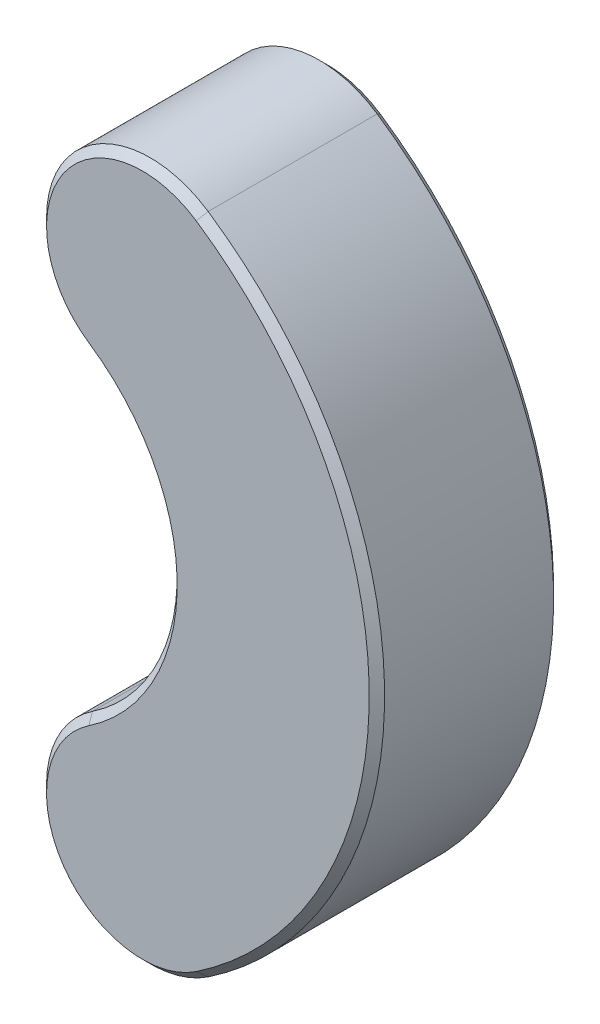
ISO-10303-21;
HEADER;
FILE_DESCRIPTION(('STEP AP214'),'2;1');
FILE_NAME('part.step','',(''),(''),'','','');
FILE_SCHEMA(('AUTOMOTIVE_DESIGN { 1 0 10303 214 1 1 1 1 }'));
ENDSEC;
DATA;
#1=APPLICATION_CONTEXT('core data for automotive mechanical design processes');
#2=APPLICATION_PROTOCOL_DEFINITION('international standard','automotive_design',2000,#1);
#3=PRODUCT_CONTEXT('',#1,'mechanical');
#4=PRODUCT('Part','Part','',(#3));
#5=PRODUCT_RELATED_PRODUCT_CATEGORY('part','',(#4));
#6=PRODUCT_DEFINITION_FORMATION('','',#4);
#7=PRODUCT_DEFINITION_CONTEXT('part definition',#1,'design');
#8=PRODUCT_DEFINITION('design','',#6,#7);
#9=PRODUCT_DEFINITION_SHAPE('','',#8);
#10=(LENGTH_UNIT() NAMED_UNIT(*) SI_UNIT(.MILLI.,.METRE.));
#11=(NAMED_UNIT(*) PLANE_ANGLE_UNIT() SI_UNIT($,.RADIAN.));
#12=(NAMED_UNIT(*) SI_UNIT($,.STERADIAN.) SOLID_ANGLE_UNIT());
#13=UNCERTAINTY_MEASURE_WITH_UNIT(LENGTH_MEASURE(1.E-05),#10,'distance_accuracy_value','');
#14=(GEOMETRIC_REPRESENTATION_CONTEXT(3) GLOBAL_UNCERTAINTY_ASSIGNED_CONTEXT((#13)) GLOBAL_UNIT_ASSIGNED_CONTEXT((#10,
#11,#12)) REPRESENTATION_CONTEXT('',''));
#15=CARTESIAN_POINT('',(0.,0.,0.));
#16=DIRECTION('',(0.,0.,1.));
#17=DIRECTION('',(1.,0.,0.));
#18=AXIS2_PLACEMENT_3D('',#15,#16,#17);
#19=CARTESIAN_POINT('',(10.75,15.97,0.));
#20=DIRECTION('',(0.,0.,1.));
#21=DIRECTION('',(-0.829564609969389,0.558410742989723,0.));
#22=AXIS2_PLACEMENT_3D('',#19,#20,#21);
#23=CYLINDRICAL_SURFACE('',#22,6.748937691649);
#24=CARTESIAN_POINT('',(10.75,15.97,11.4999769134068));
#25=DIRECTION('',(0.,0.,1.));
#26=DIRECTION('',(1.,0.,0.));
#27=AXIS2_PLACEMENT_3D('',#24,#25,#26);
#28=CIRCLE('',#27,6.748937691649);
#29=CARTESIAN_POINT('',(14.5186737627048,21.5686716093627,11.4999677547131));
#30=VERTEX_POINT('',#29);
#31=CARTESIAN_POINT('',(6.98132026801785,10.37131950514,11.5000453178294));
#32=VERTEX_POINT('',#31);
#33=EDGE_CURVE('E160',#30,#32,#28,.T.);
#34=ORIENTED_EDGE('',*,*,#33,.F.);
#35=CARTESIAN_POINT('',(14.518679318678,21.5686798585679,0.500032912311925));
#36=DIRECTION('',(0.,0.,1.));
#37=VECTOR('',#36,1.);
#38=LINE('',#35,#37);
#39=CARTESIAN_POINT('',(14.5186721658811,21.5686692320689,0.500032912311925));
#40=VERTEX_POINT('',#39);
#41=EDGE_CURVE('E133',#40,#30,#38,.T.);
#42=ORIENTED_EDGE('',*,*,#41,.F.);
#43=CARTESIAN_POINT('',(10.75,15.97,0.500023086596572));
#44=DIRECTION('',(0.,0.,-1.));
#45=DIRECTION('',(1.,0.,0.));
#46=AXIS2_PLACEMENT_3D('',#43,#44,#45);
#47=CIRCLE('',#46,6.748937691649);
#48=CARTESIAN_POINT('',(6.98132032618421,10.3713195915508,0.499954430694395));
#49=VERTEX_POINT('',#48);
#50=EDGE_CURVE('E377',#49,#40,#47,.T.);
#51=ORIENTED_EDGE('',*,*,#50,.F.);
#52=CARTESIAN_POINT('',(6.98132069710775,10.3713201308065,0.499954430694395));
#53=DIRECTION('',(0.,0.,1.));
#54=VECTOR('',#53,1.);
#55=LINE('',#52,#54);
#56=EDGE_CURVE('E11',#49,#32,#55,.T.);
#57=ORIENTED_EDGE('',*,*,#56,.T.);
#58=EDGE_LOOP('',(#34,#42,#51,#57));
#59=FACE_BOUND('',#58,.T.);
#60=ADVANCED_FACE('F17',(#59),#23,.T.);
#61=CARTESIAN_POINT('',(0.,0.,0.));
#62=DIRECTION('',(0.,0.,1.));
#63=DIRECTION('',(1.,0.,0.));
#64=AXIS2_PLACEMENT_3D('',#61,#62,#63);
#65=CYLINDRICAL_SURFACE('',#64,12.5021246167);
#66=CARTESIAN_POINT('',(0.,0.,11.5001173854218));
#67=DIRECTION('',(0.,0.,-1.));
#68=DIRECTION('',(1.,0.,0.));
#69=AXIS2_PLACEMENT_3D('',#66,#67,#68);
#70=CIRCLE('',#69,12.5021246167);
#71=CARTESIAN_POINT('',(6.98063043642681,-10.3717839486243,11.5000455693051));
#72=VERTEX_POINT('',#71);
#73=EDGE_CURVE('E403',#32,#72,#70,.T.);
#74=ORIENTED_EDGE('',*,*,#73,.F.);
#75=ORIENTED_EDGE('',*,*,#56,.F.);
#76=CARTESIAN_POINT('',(0.,0.,0.499882614573627));
#77=DIRECTION('',(0.,0.,1.));
#78=DIRECTION('',(1.,0.,0.));
#79=AXIS2_PLACEMENT_3D('',#76,#77,#78);
#80=CIRCLE('',#79,12.5021246167);
#81=CARTESIAN_POINT('',(6.9806303782662,-10.3717838622095,0.499954682169895));
#82=VERTEX_POINT('',#81);
#83=EDGE_CURVE('E351',#82,#49,#80,.T.);
#84=ORIENTED_EDGE('',*,*,#83,.F.);
#85=CARTESIAN_POINT('',(6.98063080727075,-10.3717844879306,0.499954682169895));
#86=DIRECTION('',(0.,0.,1.));
#87=VECTOR('',#86,1.);
#88=LINE('',#85,#87);
#89=EDGE_CURVE('E30',#82,#72,#88,.T.);
#90=ORIENTED_EDGE('',*,*,#89,.T.);
#91=EDGE_LOOP('',(#74,#75,#84,#90));
#92=FACE_BOUND('',#91,.T.);
#93=ADVANCED_FACE('F305',(#92),#65,.F.);
#94=CARTESIAN_POINT('',(10.74893769165,-15.97071502786,0.));
#95=DIRECTION('',(0.,0.,1.));
#96=DIRECTION('',(-0.829601752058565,-0.558355561431387,0.));
#97=AXIS2_PLACEMENT_3D('',#94,#95,#96);
#98=CYLINDRICAL_SURFACE('',#97,6.748937691649);
#99=CARTESIAN_POINT('',(10.74893769165,-15.97071502786,11.4999769134069));
#100=DIRECTION('',(0.,0.,1.));
#101=DIRECTION('',(1.,0.,0.));
#102=AXIS2_PLACEMENT_3D('',#99,#100,#101);
#103=CIRCLE('',#102,6.748937691649);
#104=CARTESIAN_POINT('',(14.5172390389381,-21.5696373058736,11.4999677547206));
#105=VERTEX_POINT('',#104);
#106=EDGE_CURVE('E93',#72,#105,#103,.T.);
#107=ORIENTED_EDGE('',*,*,#106,.F.);
#108=ORIENTED_EDGE('',*,*,#89,.F.);
#109=CARTESIAN_POINT('',(10.74893769165,-15.97071502786,0.500023086596572));
#110=DIRECTION('',(0.,0.,-1.));
#111=DIRECTION('',(1.,0.,0.));
#112=AXIS2_PLACEMENT_3D('',#109,#110,#111);
#113=CIRCLE('',#112,6.748937691649);
#114=CARTESIAN_POINT('',(14.5172390389367,-21.5696373058715,0.500032245281578));
#115=VERTEX_POINT('',#114);
#116=EDGE_CURVE('E126',#115,#82,#113,.T.);
#117=ORIENTED_EDGE('',*,*,#116,.F.);
#118=CARTESIAN_POINT('',(14.5172445950452,-21.5696455549861,0.500032245281578));
#119=DIRECTION('',(0.,0.,1.));
#120=VECTOR('',#119,1.);
#121=LINE('',#118,#120);
#122=EDGE_CURVE('E122',#115,#105,#121,.T.);
#123=ORIENTED_EDGE('',*,*,#122,.T.);
#124=EDGE_LOOP('',(#107,#108,#117,#123));
#125=FACE_BOUND('',#124,.T.);
#126=ADVANCED_FACE('F124',(#125),#98,.T.);
#127=CARTESIAN_POINT('',(10.74893769165,-15.97071502786,11.74998811715));
#128=DIRECTION('',(0.,0.,-1.));
#129=DIRECTION('',(0.,-1.,0.));
#130=AXIS2_PLACEMENT_3D('',#127,#128,#129);
#131=CONICAL_SURFACE('',#130,6.498927343135,0.785396453013004);
#132=CARTESIAN_POINT('',(10.74893769165,-15.97071502786,12.));
#133=DIRECTION('',(0.,0.,1.));
#134=DIRECTION('',(0.,-1.,0.));
#135=AXIS2_PLACEMENT_3D('',#132,#133,#134);
#136=CIRCLE('',#135,6.24891631551641);
#137=CARTESIAN_POINT('',(7.25978047352528,-10.7865435926965,12.));
#138=VERTEX_POINT('',#137);
#139=CARTESIAN_POINT('',(14.2380479832041,-21.154816699463,11.9999862518998));
#140=VERTEX_POINT('',#139);
#141=EDGE_CURVE('E156',#138,#140,#136,.T.);
#142=ORIENTED_EDGE('',*,*,#141,.F.);
#143=CARTESIAN_POINT('',(7.25980049845356,-10.7865733454301,11.9999641363117));
#144=CARTESIAN_POINT('',(7.24816921901123,-10.769291651664,11.9791327520624));
#145=CARTESIAN_POINT('',(7.23653793956877,-10.7520099578981,11.9583013678132));
#146=CARTESIAN_POINT('',(7.21327538068359,-10.7174465703663,11.9166385993146));
#147=CARTESIAN_POINT('',(7.20164410124087,-10.7001648766005,11.8958072150653));
#148=CARTESIAN_POINT('',(7.17838154235518,-10.6656014890691,11.8541444465668));
#149=CARTESIAN_POINT('',(7.1667502629122,-10.6483197953035,11.8333130623175));
#150=CARTESIAN_POINT('',(7.143487704026,-10.6137564077724,11.791650293819));
#151=CARTESIAN_POINT('',(7.13185642458277,-10.596474714007,11.7708189095697));
#152=CARTESIAN_POINT('',(7.10859386569605,-10.5619113264763,11.7291561410711));
#153=CARTESIAN_POINT('',(7.09696258625256,-10.544629632711,11.7083247568219));
#154=CARTESIAN_POINT('',(7.07370002736533,-10.5100662451806,11.6666619883233));
#155=CARTESIAN_POINT('',(7.06206874792159,-10.4927845514155,11.645830604074));
#156=CARTESIAN_POINT('',(7.03880618903385,-10.4582211638855,11.6041678355755));
#157=CARTESIAN_POINT('',(7.02717490958985,-10.4409394701205,11.5833364513262));
#158=CARTESIAN_POINT('',(7.0039123507016,-10.4063760825909,11.5416736828277));
#159=CARTESIAN_POINT('',(6.99228107125734,-10.3890943888261,11.5208422985784));
#160=CARTESIAN_POINT('',(6.98064979181296,-10.3718126950614,11.5000109143291));
#161=B_SPLINE_CURVE_WITH_KNOTS('',3,(#143,#144,#145,#146,#147,#148,#149,#150,#151,#152,#153,
#154,#155,#156,#157,#158,#159,#160),.UNSPECIFIED.,.F.,.F.,(4,2,2,2,2,2,2,2,4),(0.,
0.0883799272214632,0.176759854442926,0.265139781664388,0.353519708885851,0.441899636107314,
0.530279563328776,0.618659490550238,0.707039417771701),.UNSPECIFIED.);
#162=EDGE_CURVE('E101',#138,#72,#161,.T.);
#163=ORIENTED_EDGE('',*,*,#162,.T.);
#164=ORIENTED_EDGE('',*,*,#106,.T.);
#165=CARTESIAN_POINT('',(14.2380358986328,-21.1547987375064,11.9999646033221));
#166=CARTESIAN_POINT('',(14.2496687771154,-21.1720828073687,11.9791303521223));
#167=CARTESIAN_POINT('',(14.2613016555976,-21.1893668772312,11.9582961009226));
#168=CARTESIAN_POINT('',(14.2845674125615,-21.2239350169566,11.9166275985231));
#169=CARTESIAN_POINT('',(14.2962002910431,-21.2412190868195,11.8957933473234));
#170=CARTESIAN_POINT('',(14.3194660480056,-21.2757872265458,11.854124844924));
#171=CARTESIAN_POINT('',(14.3310989264866,-21.2930712964092,11.8332905937242));
#172=CARTESIAN_POINT('',(14.3543646834478,-21.3276394361364,11.7916220913248));
#173=CARTESIAN_POINT('',(14.3659975619281,-21.3449235060003,11.770787840125));
#174=CARTESIAN_POINT('',(14.389263318888,-21.3794916457284,11.7291193377256));
#175=CARTESIAN_POINT('',(14.4008961973676,-21.3967757155926,11.7082850865259));
#176=CARTESIAN_POINT('',(14.4241619543262,-21.4313438553216,11.6666165841264));
#177=CARTESIAN_POINT('',(14.4357948328052,-21.4486279251863,11.6457823329267));
#178=CARTESIAN_POINT('',(14.4590605897624,-21.4831960649162,11.6041138305272));
#179=CARTESIAN_POINT('',(14.4706934682407,-21.5004801347813,11.5832795793275));
#180=CARTESIAN_POINT('',(14.4939592251967,-21.5350482745121,11.541611076928));
#181=CARTESIAN_POINT('',(14.5055921036743,-21.5523323443777,11.5207768257283));
#182=CARTESIAN_POINT('',(14.5172249821516,-21.5696164142435,11.4999425745286));
#183=B_SPLINE_CURVE_WITH_KNOTS('',3,(#165,#166,#167,#168,#169,#170,#171,#172,#173,#174,#175,
#176,#177,#178,#179,#180,#181,#182),.UNSPECIFIED.,.F.,.F.,(4,2,2,2,2,2,2,2,4),(0.,
0.0883920845021293,0.176784169004258,0.265176253506387,0.353568338008516,0.441960422510645,
0.530352507012776,0.618744591514903,0.707136676017034),.UNSPECIFIED.);
#184=EDGE_CURVE('E97',#140,#105,#183,.T.);
#185=ORIENTED_EDGE('',*,*,#184,.F.);
#186=EDGE_LOOP('',(#142,#163,#164,#185));
#187=FACE_BOUND('',#186,.T.);
#188=ADVANCED_FACE('F96',(#187),#131,.T.);
#189=CARTESIAN_POINT('',(0.,0.,11.75005994661));
#190=DIRECTION('',(0.,0.,1.));
#191=DIRECTION('',(0.,-1.,0.));
#192=AXIS2_PLACEMENT_3D('',#189,#190,#191);
#193=CONICAL_SURFACE('',#192,12.75206483114,0.785393468800354);
#194=CARTESIAN_POINT('',(0.,0.,12.));
#195=DIRECTION('',(0.,0.,-1.));
#196=DIRECTION('',(0.,-1.,0.));
#197=AXIS2_PLACEMENT_3D('',#194,#195,#196);
#198=CIRCLE('',#197,13.0020025378053);
#199=CARTESIAN_POINT('',(7.26049946402204,10.7860629246955,12.0000016799332));
#200=VERTEX_POINT('',#199);
#201=EDGE_CURVE('E161',#200,#138,#198,.T.);
#202=ORIENTED_EDGE('',*,*,#201,.F.);
#203=CARTESIAN_POINT('',(7.26047915231636,10.7860327391388,12.0000380628192));
#204=CARTESIAN_POINT('',(7.24884670279024,10.7687517885002,11.9792065173696));
#205=CARTESIAN_POINT('',(7.237214253264,10.7514708378616,11.95837497192));
#206=CARTESIAN_POINT('',(7.21394935421127,10.7169089365846,11.9167118810207));
#207=CARTESIAN_POINT('',(7.20231690468477,10.6996279859462,11.8958803355711));
#208=CARTESIAN_POINT('',(7.17905200563151,10.6650660846696,11.8542172446718));
#209=CARTESIAN_POINT('',(7.16741955610475,10.6477851340314,11.8333856992222));
#210=CARTESIAN_POINT('',(7.14415465705098,10.6132232327551,11.7917226083229));
#211=CARTESIAN_POINT('',(7.13252220752397,10.5959422821171,11.7708910628733));
#212=CARTESIAN_POINT('',(7.10925730846969,10.5613803808412,11.7292279719741));
#213=CARTESIAN_POINT('',(7.09762485894241,10.5440994302033,11.7083964265244));
#214=CARTESIAN_POINT('',(7.07435995988762,10.5095375289277,11.6667333356252));
#215=CARTESIAN_POINT('',(7.06272751036009,10.49225657829,11.6459017901755));
#216=CARTESIAN_POINT('',(7.03946261130478,10.4576946770148,11.6042386992763));
#217=CARTESIAN_POINT('',(7.02783016177699,10.4404137263772,11.5834071538266));
#218=CARTESIAN_POINT('',(7.00456526272117,10.4058518251024,11.5417440629274));
#219=CARTESIAN_POINT('',(6.99293281319313,10.388570874465,11.5209125174778));
#220=CARTESIAN_POINT('',(6.98130036366496,10.3712899238277,11.5000809720281));
#221=B_SPLINE_CURVE_WITH_KNOTS('',3,(#203,#204,#205,#206,#207,#208,#209,#210,#211,#212,#213,
#214,#215,#216,#217,#218,#219,#220),.UNSPECIFIED.,.F.,.F.,(4,2,2,2,2,2,2,2,4),(0.,
0.0883803473910265,0.176760694782053,0.26514104217308,0.353521389564106,0.441901736955133,
0.530282084346159,0.618662431737186,0.707042779128212),.UNSPECIFIED.);
#222=EDGE_CURVE('E407',#200,#32,#221,.T.);
#223=ORIENTED_EDGE('',*,*,#222,.T.);
#224=ORIENTED_EDGE('',*,*,#73,.T.);
#225=ORIENTED_EDGE('',*,*,#162,.F.);
#226=EDGE_LOOP('',(#202,#223,#224,#225));
#227=FACE_BOUND('',#226,.T.);
#228=ADVANCED_FACE('F184',(#227),#193,.F.);
#229=CARTESIAN_POINT('',(10.75,15.97,11.74998811715));
#230=DIRECTION('',(0.,0.,-1.));
#231=DIRECTION('',(-0.82956460981326,0.558410743221666,0.));
#232=AXIS2_PLACEMENT_3D('',#229,#230,#231);
#233=CONICAL_SURFACE('',#232,6.498927343135,0.78539645301283);
#234=CARTESIAN_POINT('',(10.75,15.97,12.));
#235=DIRECTION('',(0.,0.,1.));
#236=DIRECTION('',(0.,-1.,0.));
#237=AXIS2_PLACEMENT_3D('',#234,#235,#236);
#238=CIRCLE('',#237,6.2489163155165);
#239=CARTESIAN_POINT('',(14.2394551140077,21.1538695754605,11.9999862518984));
#240=VERTEX_POINT('',#239);
#241=EDGE_CURVE('E167',#240,#200,#238,.T.);
#242=ORIENTED_EDGE('',*,*,#241,.F.);
#243=CARTESIAN_POINT('',(14.2394624031244,21.1538803989538,11.9999993010646));
#244=CARTESIAN_POINT('',(14.2510964321247,21.1711636961601,11.9791650513117));
#245=CARTESIAN_POINT('',(14.2627304611238,21.1884469933671,11.9583308015587));
#246=CARTESIAN_POINT('',(14.2859985191196,21.2230135877829,11.9166623020528));
#247=CARTESIAN_POINT('',(14.2976325481162,21.2402968849916,11.8958280522998));
#248=CARTESIAN_POINT('',(14.3209006061071,21.2748634794107,11.8541595527939));
#249=CARTESIAN_POINT('',(14.3325346351014,21.292146776621,11.833325303041));
#250=CARTESIAN_POINT('',(14.3558026930875,21.3267133710433,11.791656803535));
#251=CARTESIAN_POINT('',(14.3674367220794,21.3439966682552,11.7708225537821));
#252=CARTESIAN_POINT('',(14.3907047800606,21.3785632626807,11.7291540542762));
#253=CARTESIAN_POINT('',(14.4023388090501,21.3958465598943,11.7083198045232));
#254=CARTESIAN_POINT('',(14.4256068670266,21.4304131543231,11.6666513050173));
#255=CARTESIAN_POINT('',(14.4372408960136,21.4476964515383,11.6458170552644));
#256=CARTESIAN_POINT('',(14.4605089539852,21.4822630459703,11.6041485557584));
#257=CARTESIAN_POINT('',(14.4721429829698,21.4995463431871,11.5833143060055));
#258=CARTESIAN_POINT('',(14.4954110409367,21.5341129376224,11.5416458064996));
#259=CARTESIAN_POINT('',(14.5070450699189,21.5513962348408,11.5208115567466));
#260=CARTESIAN_POINT('',(14.5186790988999,21.5686795320601,11.4999773069937));
#261=B_SPLINE_CURVE_WITH_KNOTS('',3,(#243,#244,#245,#246,#247,#248,#249,#250,#251,#252,#253,
#254,#255,#256,#257,#258,#259,#260),.UNSPECIFIED.,.F.,.F.,(4,2,2,2,2,2,2,2,4),(0.,
0.0883920845031658,0.17678416900633,0.265176253509493,0.353568338012658,0.441960422515823,
0.530352507018988,0.618744591522152,0.707136676025318),.UNSPECIFIED.);
#262=EDGE_CURVE('E118',#240,#30,#261,.T.);
#263=ORIENTED_EDGE('',*,*,#262,.T.);
#264=ORIENTED_EDGE('',*,*,#33,.T.);
#265=ORIENTED_EDGE('',*,*,#222,.F.);
#266=EDGE_LOOP('',(#242,#263,#264,#265));
#267=FACE_BOUND('',#266,.T.);
#268=ADVANCED_FACE('F185',(#267),#233,.T.);
#269=CARTESIAN_POINT('',(0.,0.,12.));
#270=DIRECTION('',(0.,0.,1.));
#271=DIRECTION('',(1.,0.,0.));
#272=AXIS2_PLACEMENT_3D('',#269,#270,#271);
#273=PLANE('',#272);
#274=ORIENTED_EDGE('',*,*,#241,.T.);
#275=ORIENTED_EDGE('',*,*,#201,.T.);
#276=ORIENTED_EDGE('',*,*,#141,.T.);
#277=CARTESIAN_POINT('',(-2.025046796916E-13,0.,12.));
#278=DIRECTION('',(0.,0.,1.));
#279=DIRECTION('',(0.,-1.,0.));
#280=AXIS2_PLACEMENT_3D('',#277,#278,#279);
#281=CIRCLE('',#280,25.4999092283912);
#282=EDGE_CURVE('E116',#140,#240,#281,.T.);
#283=ORIENTED_EDGE('',*,*,#282,.T.);
#284=EDGE_LOOP('',(#274,#275,#276,#283));
#285=FACE_BOUND('',#284,.T.);
#286=ADVANCED_FACE('F274',(#285),#273,.T.);
#287=CARTESIAN_POINT('',(-2.025046796916E-13,0.,11.74995407834));
#288=DIRECTION('',(0.,0.,-1.));
#289=DIRECTION('',(0.,-1.,0.));
#290=AXIS2_PLACEMENT_3D('',#287,#288,#289);
#291=CONICAL_SURFACE('',#290,25.74995425997,0.785396383558848);
#292=ORIENTED_EDGE('',*,*,#282,.F.);
#293=ORIENTED_EDGE('',*,*,#184,.T.);
#294=CARTESIAN_POINT('',(0.,0.,11.4999074482263));
#295=DIRECTION('',(0.,0.,1.));
#296=DIRECTION('',(1.,0.,0.));
#297=AXIS2_PLACEMENT_3D('',#294,#295,#296);
#298=CIRCLE('',#297,26.);
#299=EDGE_CURVE('E114',#105,#30,#298,.T.);
#300=ORIENTED_EDGE('',*,*,#299,.T.);
#301=ORIENTED_EDGE('',*,*,#262,.F.);
#302=EDGE_LOOP('',(#292,#293,#300,#301));
#303=FACE_BOUND('',#302,.T.);
#304=ADVANCED_FACE('F111',(#303),#291,.T.);
#305=CARTESIAN_POINT('',(0.,0.,0.));
#306=DIRECTION('',(0.,0.,1.));
#307=DIRECTION('',(1.,0.,0.));
#308=AXIS2_PLACEMENT_3D('',#305,#306,#307);
#309=CYLINDRICAL_SURFACE('',#308,26.);
#310=ORIENTED_EDGE('',*,*,#299,.F.);
#311=ORIENTED_EDGE('',*,*,#122,.F.);
#312=CARTESIAN_POINT('',(0.,0.,0.500092551774502));
#313=DIRECTION('',(0.,0.,-1.));
#314=DIRECTION('',(1.,0.,0.));
#315=AXIS2_PLACEMENT_3D('',#312,#313,#314);
#316=CIRCLE('',#315,26.);
#317=EDGE_CURVE('E140',#40,#115,#316,.T.);
#318=ORIENTED_EDGE('',*,*,#317,.F.);
#319=ORIENTED_EDGE('',*,*,#41,.T.);
#320=EDGE_LOOP('',(#310,#311,#318,#319));
#321=FACE_BOUND('',#320,.T.);
#322=ADVANCED_FACE('F137',(#321),#309,.T.);
#323=CARTESIAN_POINT('',(2.238209617644E-13,-2.327027459614E-13,0.2500459216608));
#324=DIRECTION('',(0.,0.,1.));
#325=DIRECTION('',(0.,-1.,0.));
#326=AXIS2_PLACEMENT_3D('',#323,#324,#325);
#327=CONICAL_SURFACE('',#326,25.74995425997,0.785396383558848);
#328=CARTESIAN_POINT('',(2.238209617644E-13,-2.327027459614E-13,0.));
#329=DIRECTION('',(0.,0.,-1.));
#330=DIRECTION('',(0.,-1.,0.));
#331=AXIS2_PLACEMENT_3D('',#328,#329,#330);
#332=CIRCLE('',#331,25.4999092283904);
#333=CARTESIAN_POINT('',(14.2394542489906,21.1538682834399,1.81405290800276E-05));
#334=VERTEX_POINT('',#333);
#335=CARTESIAN_POINT('',(14.2380471193372,-21.1548154066625,1.81405294511351E-05));
#336=VERTEX_POINT('',#335);
#337=EDGE_CURVE('E222',#334,#336,#332,.T.);
#338=ORIENTED_EDGE('',*,*,#337,.F.);
#339=CARTESIAN_POINT('',(14.2394438197174,21.1538527917901,3.68154407839861E-05));
#340=CARTESIAN_POINT('',(14.2510777893348,21.171136000795,0.0208709617585791));
#341=CARTESIAN_POINT('',(14.2627117589519,21.1884192098,0.0417051080763736));
#342=CARTESIAN_POINT('',(14.2859796981857,21.2229856278103,0.0833734007119627));
#343=CARTESIAN_POINT('',(14.2976136678024,21.2402688368156,0.104207547029757));
#344=CARTESIAN_POINT('',(14.3208816070353,21.2748352548266,0.145875839665346));
#345=CARTESIAN_POINT('',(14.3325155766515,21.2921184638323,0.166709985983141));
#346=CARTESIAN_POINT('',(14.3557835158834,21.3266848818439,0.20837827861873));
#347=CARTESIAN_POINT('',(14.3674174854991,21.3439680908498,0.229212424936525));
#348=CARTESIAN_POINT('',(14.3906854247301,21.3785345088621,0.270880717572114));
#349=CARTESIAN_POINT('',(14.4023193943453,21.3958177178684,0.291714863889909));
#350=CARTESIAN_POINT('',(14.4255873335753,21.4303841358813,0.333383156525498));
#351=CARTESIAN_POINT('',(14.4372213031901,21.4476673448879,0.354217302843293));
#352=CARTESIAN_POINT('',(14.4604892424192,21.4822337629014,0.395885595478883));
#353=CARTESIAN_POINT('',(14.4721232120335,21.4995169719084,0.416719741796677));
#354=CARTESIAN_POINT('',(14.4953911512616,21.5340833899225,0.458388034432266));
#355=CARTESIAN_POINT('',(14.5070251208754,21.5513665989298,0.47922218075006));
#356=CARTESIAN_POINT('',(14.518659090489,21.5686498079372,0.500056327067855));
#357=B_SPLINE_CURVE_WITH_KNOTS('',3,(#339,#340,#341,#342,#343,#344,#345,#346,#347,#348,#349,
#350,#351,#352,#353,#354,#355,#356),.UNSPECIFIED.,.F.,.F.,(4,2,2,2,2,2,2,2,4),(0.,
0.0883916395265588,0.17678327905312,0.26517491857968,0.353566558106239,0.441958197632799,
0.530349837159358,0.61874147668592,0.707133116212481),.UNSPECIFIED.);
#358=EDGE_CURVE('E146',#334,#40,#357,.T.);
#359=ORIENTED_EDGE('',*,*,#358,.T.);
#360=ORIENTED_EDGE('',*,*,#317,.T.);
#361=CARTESIAN_POINT('',(14.2380560645485,-21.1548286999179,2.11770446648498E-06));
#362=CARTESIAN_POINT('',(14.2496889108425,-21.1721127219316,0.0208363083419923));
#363=CARTESIAN_POINT('',(14.2613217571348,-21.1893967439464,0.0416704989795193));
#364=CARTESIAN_POINT('',(14.2845874497162,-21.2239647879782,0.0833388802545732));
#365=CARTESIAN_POINT('',(14.2962202960052,-21.2412488099952,0.1041730708921));
#366=CARTESIAN_POINT('',(14.3194859885799,-21.2758168540315,0.145841452167153));
#367=CARTESIAN_POINT('',(14.3311188348656,-21.2931008760508,0.166675642804679));
#368=CARTESIAN_POINT('',(14.3543845274336,-21.3276689200915,0.208344024079732));
#369=CARTESIAN_POINT('',(14.366017373716,-21.344952942113,0.229178214717259));
#370=CARTESIAN_POINT('',(14.3892830662775,-21.3795209861582,0.270846595992313));
#371=CARTESIAN_POINT('',(14.4009159125565,-21.396805008182,0.29168078662984));
#372=CARTESIAN_POINT('',(14.4241816051113,-21.4313730522316,0.333349167904893));
#373=CARTESIAN_POINT('',(14.4358144513871,-21.4486570742576,0.35418335854242));
#374=CARTESIAN_POINT('',(14.4590801439353,-21.4832251183117,0.395851739817473));
#375=CARTESIAN_POINT('',(14.4707129902077,-21.5005091403399,0.416685930454999));
#376=CARTESIAN_POINT('',(14.4939786827493,-21.5350771843985,0.458354311730052));
#377=CARTESIAN_POINT('',(14.5056115290184,-21.5523612064289,0.479188502367579));
#378=CARTESIAN_POINT('',(14.5172443752858,-21.5696452284604,0.500022693005106));
#379=B_SPLINE_CURVE_WITH_KNOTS('',3,(#361,#362,#363,#364,#365,#366,#367,#368,#369,#370,#371,
#372,#373,#374,#375,#376,#377,#378),.UNSPECIFIED.,.F.,.F.,(4,2,2,2,2,2,2,2,4),(0.,
0.0883918336980677,0.176783667396133,0.265175501094202,0.353567334792268,0.441959168490333,
0.5303510021884,0.618742835886468,0.707134669584534),.UNSPECIFIED.);
#380=EDGE_CURVE('E231',#336,#115,#379,.T.);
#381=ORIENTED_EDGE('',*,*,#380,.F.);
#382=EDGE_LOOP('',(#338,#359,#360,#381));
#383=FACE_BOUND('',#382,.T.);
#384=ADVANCED_FACE('F19',(#383),#327,.T.);
#385=CARTESIAN_POINT('',(10.75,15.97,0.2500118828534));
#386=DIRECTION('',(0.,0.,1.));
#387=DIRECTION('',(-0.82956460981326,0.558410743221666,0.));
#388=AXIS2_PLACEMENT_3D('',#385,#386,#387);
#389=CONICAL_SURFACE('',#388,6.498927343135,0.78539645301283);
#390=CARTESIAN_POINT('',(10.75,15.97,0.));
#391=DIRECTION('',(0.,0.,-1.));
#392=DIRECTION('',(0.,-1.,0.));
#393=AXIS2_PLACEMENT_3D('',#390,#391,#392);
#394=CIRCLE('',#393,6.2489163155131);
#395=CARTESIAN_POINT('',(7.26049795115573,10.7860606665333,0.));
#396=VERTEX_POINT('',#395);
#397=EDGE_CURVE('E232',#396,#334,#394,.T.);
#398=ORIENTED_EDGE('',*,*,#397,.F.);
#399=CARTESIAN_POINT('',(7.2605333185168,10.7861132074166,8.39197547699644E-06));
#400=DIRECTION('',(-0.394855346873582,-0.586589758400813,0.707107990610075));
#401=VECTOR('',#400,1.);
#402=LINE('',#399,#401);
#403=EDGE_CURVE('E291',#396,#49,#402,.T.);
#404=ORIENTED_EDGE('',*,*,#403,.T.);
#405=ORIENTED_EDGE('',*,*,#50,.T.);
#406=ORIENTED_EDGE('',*,*,#358,.F.);
#407=EDGE_LOOP('',(#398,#404,#405,#406));
#408=FACE_BOUND('',#407,.T.);
#409=ADVANCED_FACE('F262',(#408),#389,.T.);
#410=CARTESIAN_POINT('',(0.,0.,0.2499400533854));
#411=DIRECTION('',(0.,0.,-1.));
#412=DIRECTION('',(0.,-1.,0.));
#413=AXIS2_PLACEMENT_3D('',#410,#411,#412);
#414=CONICAL_SURFACE('',#413,12.75206483114,0.785393468800354);
#415=CARTESIAN_POINT('',(0.,0.,0.));
#416=DIRECTION('',(0.,0.,1.));
#417=DIRECTION('',(0.,-1.,0.));
#418=AXIS2_PLACEMENT_3D('',#415,#416,#417);
#419=CIRCLE('',#418,13.0020025378007);
#420=CARTESIAN_POINT('',(7.25978198595848,-10.786545851148,-1.67993305805655E-06));
#421=VERTEX_POINT('',#420);
#422=EDGE_CURVE('E238',#421,#396,#419,.T.);
#423=ORIENTED_EDGE('',*,*,#422,.F.);
#424=CARTESIAN_POINT('',(7.25976167654647,-10.786515664045,-3.80628216035527E-05));
#425=CARTESIAN_POINT('',(7.24813037651757,-10.7692339396926,0.0207934826279935));
#426=CARTESIAN_POINT('',(7.23649907648861,-10.7519522153404,0.0416250280775906));
#427=CARTESIAN_POINT('',(7.21323647643055,-10.7173887666359,0.0832881189767849));
#428=CARTESIAN_POINT('',(7.20160517640147,-10.7001070422837,0.104119664426382));
#429=CARTESIAN_POINT('',(7.17834257634317,-10.6655435935794,0.145782755325576));
#430=CARTESIAN_POINT('',(7.16671127631396,-10.6482618692273,0.166614300775174));
#431=CARTESIAN_POINT('',(7.14344867625541,-10.6136984205232,0.208277391674368));
#432=CARTESIAN_POINT('',(7.13181737622607,-10.5964166961711,0.229108937123965));
#433=CARTESIAN_POINT('',(7.10855477616728,-10.5618532474672,0.270772028023159));
#434=CARTESIAN_POINT('',(7.09692347613782,-10.5445715231152,0.291603573472756));
#435=CARTESIAN_POINT('',(7.07366087607877,-10.5100080744114,0.333266664371951));
#436=CARTESIAN_POINT('',(7.06202957604919,-10.4927263500596,0.354098209821548));
#437=CARTESIAN_POINT('',(7.0387669759899,-10.4581629013559,0.395761300720742));
#438=CARTESIAN_POINT('',(7.02713567596019,-10.4408811770042,0.416592846170339));
#439=CARTESIAN_POINT('',(7.00387307590064,-10.4063177283007,0.458255937069533));
#440=CARTESIAN_POINT('',(6.99224177587081,-10.389036003949,0.47908748251913));
#441=CARTESIAN_POINT('',(6.98061047584092,-10.3717542795974,0.499919027968728));
#442=B_SPLINE_CURVE_WITH_KNOTS('',3,(#424,#425,#426,#427,#428,#429,#430,#431,#432,#433,#434,
#435,#436,#437,#438,#439,#440,#441),.UNSPECIFIED.,.F.,.F.,(4,2,2,2,2,2,2,2,4),(0.,
0.088380347390887,0.176760694781773,0.26514104217266,0.353521389563549,0.441901736954436,
0.530282084345322,0.61866243173621,0.707042779127097),.UNSPECIFIED.);
#443=EDGE_CURVE('E322',#421,#82,#442,.T.);
#444=ORIENTED_EDGE('',*,*,#443,.T.);
#445=ORIENTED_EDGE('',*,*,#83,.T.);
#446=ORIENTED_EDGE('',*,*,#403,.F.);
#447=EDGE_LOOP('',(#423,#444,#445,#446));
#448=FACE_BOUND('',#447,.T.);
#449=ADVANCED_FACE('F271',(#448),#414,.F.);
#450=CARTESIAN_POINT('',(10.74893769165,-15.97071502786,0.2500118828534));
#451=DIRECTION('',(0.,0.,1.));
#452=DIRECTION('',(0.,-1.,0.));
#453=AXIS2_PLACEMENT_3D('',#450,#451,#452);
#454=CONICAL_SURFACE('',#453,6.498927343135,0.78539645301283);
#455=CARTESIAN_POINT('',(10.74893769165,-15.97071502786,0.));
#456=DIRECTION('',(0.,0.,-1.));
#457=DIRECTION('',(0.,-1.,0.));
#458=AXIS2_PLACEMENT_3D('',#455,#456,#457);
#459=CIRCLE('',#458,6.2489163155131);
#460=EDGE_CURVE('E295',#336,#421,#459,.T.);
#461=ORIENTED_EDGE('',*,*,#460,.F.);
#462=ORIENTED_EDGE('',*,*,#380,.T.);
#463=ORIENTED_EDGE('',*,*,#116,.T.);
#464=ORIENTED_EDGE('',*,*,#443,.F.);
#465=EDGE_LOOP('',(#461,#462,#463,#464));
#466=FACE_BOUND('',#465,.T.);
#467=ADVANCED_FACE('F215',(#466),#454,.T.);
#468=CARTESIAN_POINT('',(0.,0.,0.));
#469=DIRECTION('',(0.,0.,1.));
#470=DIRECTION('',(1.,0.,0.));
#471=AXIS2_PLACEMENT_3D('',#468,#469,#470);
#472=PLANE('',#471);
#473=ORIENTED_EDGE('',*,*,#460,.T.);
#474=ORIENTED_EDGE('',*,*,#422,.T.);
#475=ORIENTED_EDGE('',*,*,#397,.T.);
#476=ORIENTED_EDGE('',*,*,#337,.T.);
#477=EDGE_LOOP('',(#473,#474,#475,#476));
#478=FACE_BOUND('',#477,.T.);
#479=ADVANCED_FACE('F272',(#478),#472,.F.);
#480=CLOSED_SHELL('',(#60,#93,#126,#188,#228,#268,#286,#304,#322,#384,#409,#449,#467,#479));
#481=MANIFOLD_SOLID_BREP('B1',#480);
#482=ADVANCED_BREP_SHAPE_REPRESENTATION('',(#18,#481),#14);
#483=SHAPE_DEFINITION_REPRESENTATION(#9,#482);
ENDSEC;
END-ISO-10303-21;
